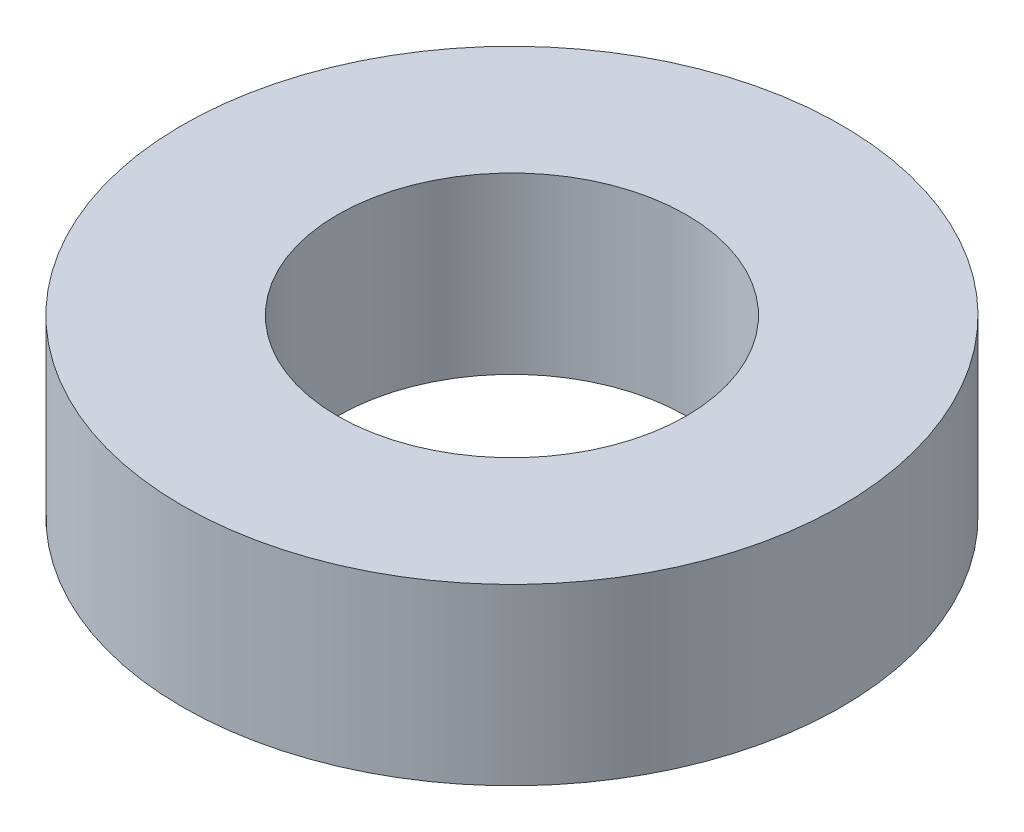
ISO-10303-21;
HEADER;
FILE_DESCRIPTION(('STEP AP214'),'2;1');
FILE_NAME('part.step','',(''),(''),'','','');
FILE_SCHEMA(('AUTOMOTIVE_DESIGN { 1 0 10303 214 1 1 1 1 }'));
ENDSEC;
DATA;
#1=APPLICATION_CONTEXT('core data for automotive mechanical design processes');
#2=APPLICATION_PROTOCOL_DEFINITION('international standard','automotive_design',2000,#1);
#3=PRODUCT_CONTEXT('',#1,'mechanical');
#4=PRODUCT('Part','Part','',(#3));
#5=PRODUCT_RELATED_PRODUCT_CATEGORY('part','',(#4));
#6=PRODUCT_DEFINITION_FORMATION('','',#4);
#7=PRODUCT_DEFINITION_CONTEXT('part definition',#1,'design');
#8=PRODUCT_DEFINITION('design','',#6,#7);
#9=PRODUCT_DEFINITION_SHAPE('','',#8);
#10=(LENGTH_UNIT() NAMED_UNIT(*) SI_UNIT(.MILLI.,.METRE.));
#11=(NAMED_UNIT(*) PLANE_ANGLE_UNIT() SI_UNIT($,.RADIAN.));
#12=(NAMED_UNIT(*) SI_UNIT($,.STERADIAN.) SOLID_ANGLE_UNIT());
#13=UNCERTAINTY_MEASURE_WITH_UNIT(LENGTH_MEASURE(1.E-05),#10,'distance_accuracy_value','');
#14=(GEOMETRIC_REPRESENTATION_CONTEXT(3) GLOBAL_UNCERTAINTY_ASSIGNED_CONTEXT((#13)) GLOBAL_UNIT_ASSIGNED_CONTEXT((#10,
#11,#12)) REPRESENTATION_CONTEXT('',''));
#15=CARTESIAN_POINT('',(0.,0.,0.));
#16=DIRECTION('',(0.,0.,1.));
#17=DIRECTION('',(1.,0.,0.));
#18=AXIS2_PLACEMENT_3D('',#15,#16,#17);
#19=CARTESIAN_POINT('',(0.,5.,0.));
#20=DIRECTION('',(0.,-1.,0.));
#21=DIRECTION('',(0.,0.,-1.));
#22=AXIS2_PLACEMENT_3D('',#19,#20,#21);
#23=CYLINDRICAL_SURFACE('',#22,9.45);
#24=CARTESIAN_POINT('',(0.,5.,0.));
#25=DIRECTION('',(0.,1.,0.));
#26=DIRECTION('',(0.,0.,1.));
#27=AXIS2_PLACEMENT_3D('',#24,#25,#26);
#28=CIRCLE('',#27,9.45);
#29=CARTESIAN_POINT('',(0.,5.,9.45));
#30=VERTEX_POINT('',#29);
#31=EDGE_CURVE('E10',#30,#30,#28,.T.);
#32=ORIENTED_EDGE('',*,*,#31,.F.);
#33=EDGE_LOOP('',(#32));
#34=FACE_BOUND('',#33,.T.);
#35=CARTESIAN_POINT('',(0.,0.,0.));
#36=DIRECTION('',(0.,1.,0.));
#37=DIRECTION('',(0.,0.,1.));
#38=AXIS2_PLACEMENT_3D('',#35,#36,#37);
#39=CIRCLE('',#38,9.45);
#40=CARTESIAN_POINT('',(0.,0.,9.45));
#41=VERTEX_POINT('',#40);
#42=EDGE_CURVE('E39',#41,#41,#39,.T.);
#43=ORIENTED_EDGE('',*,*,#42,.T.);
#44=EDGE_LOOP('',(#43));
#45=FACE_BOUND('',#44,.T.);
#46=ADVANCED_FACE('F36',(#34,#45),#23,.T.);
#47=CARTESIAN_POINT('',(0.,5.,0.));
#48=DIRECTION('',(0.,1.,0.));
#49=DIRECTION('',(0.,0.,1.));
#50=AXIS2_PLACEMENT_3D('',#47,#48,#49);
#51=PLANE('',#50);
#52=CARTESIAN_POINT('',(0.,5.,0.));
#53=DIRECTION('',(0.,1.,0.));
#54=DIRECTION('',(0.,0.,1.));
#55=AXIS2_PLACEMENT_3D('',#52,#53,#54);
#56=CIRCLE('',#55,5.);
#57=CARTESIAN_POINT('',(0.,5.,-5.));
#58=VERTEX_POINT('',#57);
#59=EDGE_CURVE('E46',#58,#58,#56,.T.);
#60=ORIENTED_EDGE('',*,*,#59,.F.);
#61=EDGE_LOOP('',(#60));
#62=FACE_BOUND('',#61,.T.);
#63=ORIENTED_EDGE('',*,*,#31,.T.);
#64=EDGE_LOOP('',(#63));
#65=FACE_BOUND('',#64,.T.);
#66=ADVANCED_FACE('F59',(#62,#65),#51,.T.);
#67=CARTESIAN_POINT('',(0.,0.,0.));
#68=DIRECTION('',(0.,1.,0.));
#69=DIRECTION('',(0.,0.,1.));
#70=AXIS2_PLACEMENT_3D('',#67,#68,#69);
#71=PLANE('',#70);
#72=CARTESIAN_POINT('',(0.,0.,0.));
#73=DIRECTION('',(0.,-1.,0.));
#74=DIRECTION('',(0.,0.,-1.));
#75=AXIS2_PLACEMENT_3D('',#72,#73,#74);
#76=CIRCLE('',#75,5.);
#77=CARTESIAN_POINT('',(0.,0.,-5.));
#78=VERTEX_POINT('',#77);
#79=EDGE_CURVE('E50',#78,#78,#76,.T.);
#80=ORIENTED_EDGE('',*,*,#79,.F.);
#81=EDGE_LOOP('',(#80));
#82=FACE_BOUND('',#81,.T.);
#83=ORIENTED_EDGE('',*,*,#42,.F.);
#84=EDGE_LOOP('',(#83));
#85=FACE_BOUND('',#84,.T.);
#86=ADVANCED_FACE('F56',(#82,#85),#71,.F.);
#87=CARTESIAN_POINT('',(0.,7.7,0.));
#88=DIRECTION('',(0.,-1.,0.));
#89=DIRECTION('',(0.,0.,-1.));
#90=AXIS2_PLACEMENT_3D('',#87,#88,#89);
#91=CYLINDRICAL_SURFACE('',#90,5.);
#92=CARTESIAN_POINT('',(0.,5.,-5.));
#93=CARTESIAN_POINT('',(0.,4.94791666666667,-5.));
#94=CARTESIAN_POINT('',(0.,4.89583333333333,-5.));
#95=CARTESIAN_POINT('',(0.,4.79166666666667,-5.));
#96=CARTESIAN_POINT('',(0.,4.73958333333333,-5.));
#97=CARTESIAN_POINT('',(0.,4.63541666666667,-5.));
#98=CARTESIAN_POINT('',(0.,4.58333333333333,-5.));
#99=CARTESIAN_POINT('',(0.,4.47916666666667,-5.));
#100=CARTESIAN_POINT('',(0.,4.42708333333333,-5.));
#101=CARTESIAN_POINT('',(0.,4.32291666666667,-5.));
#102=CARTESIAN_POINT('',(0.,4.27083333333333,-5.));
#103=CARTESIAN_POINT('',(0.,4.16666666666667,-5.));
#104=CARTESIAN_POINT('',(0.,4.11458333333333,-5.));
#105=CARTESIAN_POINT('',(0.,4.01041666666667,-5.));
#106=CARTESIAN_POINT('',(0.,3.95833333333333,-5.));
#107=CARTESIAN_POINT('',(0.,3.85416666666667,-5.));
#108=CARTESIAN_POINT('',(0.,3.80208333333333,-5.));
#109=CARTESIAN_POINT('',(0.,3.69791666666667,-5.));
#110=CARTESIAN_POINT('',(0.,3.64583333333333,-5.));
#111=CARTESIAN_POINT('',(0.,3.54166666666667,-5.));
#112=CARTESIAN_POINT('',(0.,3.48958333333333,-5.));
#113=CARTESIAN_POINT('',(0.,3.38541666666667,-5.));
#114=CARTESIAN_POINT('',(0.,3.33333333333333,-5.));
#115=CARTESIAN_POINT('',(0.,3.22916666666667,-5.));
#116=CARTESIAN_POINT('',(0.,3.17708333333333,-5.));
#117=CARTESIAN_POINT('',(0.,3.07291666666667,-5.));
#118=CARTESIAN_POINT('',(0.,3.02083333333333,-5.));
#119=CARTESIAN_POINT('',(0.,2.91666666666667,-5.));
#120=CARTESIAN_POINT('',(0.,2.86458333333333,-5.));
#121=CARTESIAN_POINT('',(0.,2.76041666666667,-5.));
#122=CARTESIAN_POINT('',(0.,2.70833333333333,-5.));
#123=CARTESIAN_POINT('',(0.,2.60416666666667,-5.));
#124=CARTESIAN_POINT('',(0.,2.55208333333333,-5.));
#125=CARTESIAN_POINT('',(0.,2.44791666666667,-5.));
#126=CARTESIAN_POINT('',(0.,2.39583333333333,-5.));
#127=CARTESIAN_POINT('',(0.,2.29166666666667,-5.));
#128=CARTESIAN_POINT('',(0.,2.23958333333333,-5.));
#129=CARTESIAN_POINT('',(0.,2.13541666666667,-5.));
#130=CARTESIAN_POINT('',(0.,2.08333333333333,-5.));
#131=CARTESIAN_POINT('',(0.,1.97916666666667,-5.));
#132=CARTESIAN_POINT('',(0.,1.92708333333333,-5.));
#133=CARTESIAN_POINT('',(0.,1.82291666666667,-5.));
#134=CARTESIAN_POINT('',(0.,1.77083333333333,-5.));
#135=CARTESIAN_POINT('',(0.,1.66666666666667,-5.));
#136=CARTESIAN_POINT('',(0.,1.61458333333333,-5.));
#137=CARTESIAN_POINT('',(0.,1.51041666666667,-5.));
#138=CARTESIAN_POINT('',(0.,1.45833333333333,-5.));
#139=CARTESIAN_POINT('',(0.,1.35416666666667,-5.));
#140=CARTESIAN_POINT('',(0.,1.30208333333333,-5.));
#141=CARTESIAN_POINT('',(0.,1.19791666666667,-5.));
#142=CARTESIAN_POINT('',(0.,1.14583333333333,-5.));
#143=CARTESIAN_POINT('',(0.,1.04166666666667,-5.));
#144=CARTESIAN_POINT('',(0.,0.989583333333334,-5.));
#145=CARTESIAN_POINT('',(0.,0.885416666666668,-5.));
#146=CARTESIAN_POINT('',(0.,0.833333333333334,-5.));
#147=CARTESIAN_POINT('',(0.,0.729166666666667,-5.));
#148=CARTESIAN_POINT('',(0.,0.677083333333334,-5.));
#149=CARTESIAN_POINT('',(0.,0.572916666666667,-5.));
#150=CARTESIAN_POINT('',(0.,0.520833333333334,-5.));
#151=CARTESIAN_POINT('',(0.,0.416666666666667,-5.));
#152=CARTESIAN_POINT('',(0.,0.364583333333334,-5.));
#153=CARTESIAN_POINT('',(0.,0.260416666666668,-5.));
#154=CARTESIAN_POINT('',(0.,0.208333333333334,-5.));
#155=CARTESIAN_POINT('',(0.,0.104166666666668,-5.));
#156=CARTESIAN_POINT('',(0.,0.0520833333333343,-5.));
#157=CARTESIAN_POINT('',(0.,0.,-5.));
#158=B_SPLINE_CURVE_WITH_KNOTS('',3,(#92,#93,#94,#95,#96,#97,#98,#99,#100,#101,#102,#103,#104,
#105,#106,#107,#108,#109,#110,#111,#112,#113,#114,#115,#116,#117,#118,#119,#120,#121,#122,#123,
#124,#125,#126,#127,#128,#129,#130,#131,#132,#133,#134,#135,#136,#137,#138,#139,#140,#141,#142,
#143,#144,#145,#146,#147,#148,#149,#150,#151,#152,#153,#154,#155,#156,#157),.UNSPECIFIED.,.F.,
.F.,(4,2,2,2,2,2,2,2,2,2,2,2,2,2,2,2,2,2,2,2,2,2,2,2,2,2,2,2,2,2,2,2,4),(0.,0.15625,
0.312499999999999,0.46875,0.624999999999999,0.781249999999999,0.937499999999999,1.09375,1.25,
1.40625,1.5625,1.71875,1.875,2.03125,2.1875,2.34375,2.5,2.65625,2.8125,2.96875,3.125,3.28125,
3.4375,3.59375,3.75,3.90625,4.0625,4.21875,4.375,4.53125,4.6875,4.84375,5.),.UNSPECIFIED.);
#159=EDGE_CURVE('BSEAM54',#58,#78,#158,.T.);
#160=ORIENTED_EDGE('',*,*,#59,.T.);
#161=ORIENTED_EDGE('',*,*,#79,.T.);
#162=ORIENTED_EDGE('',*,*,#159,.T.);
#163=ORIENTED_EDGE('',*,*,#159,.F.);
#164=EDGE_LOOP('',(#160,#162,#161,#163));
#165=FACE_BOUND('',#164,.T.);
#166=ADVANCED_FACE('F54',(#165),#91,.F.);
#167=CLOSED_SHELL('',(#46,#66,#86,#166));
#168=MANIFOLD_SOLID_BREP('B2',#167);
#169=ADVANCED_BREP_SHAPE_REPRESENTATION('',(#18,#168),#14);
#170=SHAPE_DEFINITION_REPRESENTATION(#9,#169);
ENDSEC;
END-ISO-10303-21;
